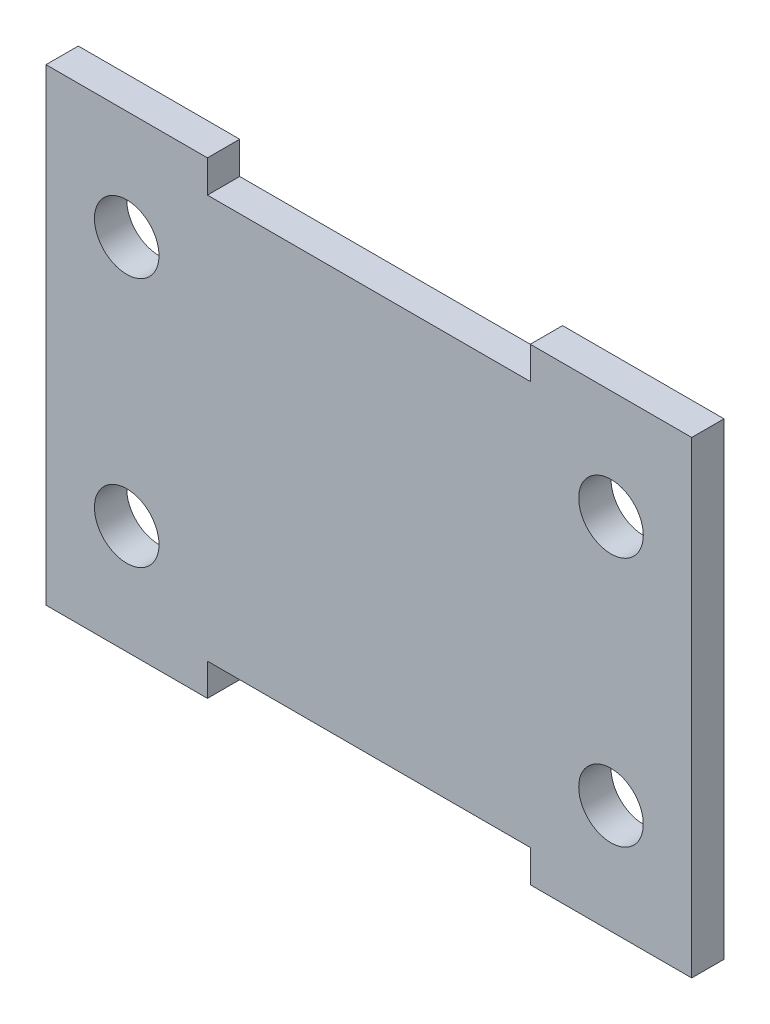
ISO-10303-21;
HEADER;
FILE_DESCRIPTION(('STEP AP214'),'2;1');
FILE_NAME('part.step','',(''),(''),'','','');
FILE_SCHEMA(('AUTOMOTIVE_DESIGN { 1 0 10303 214 1 1 1 1 }'));
ENDSEC;
DATA;
#1=APPLICATION_CONTEXT('core data for automotive mechanical design processes');
#2=APPLICATION_PROTOCOL_DEFINITION('international standard','automotive_design',2000,#1);
#3=PRODUCT_CONTEXT('',#1,'mechanical');
#4=PRODUCT('Part','Part','',(#3));
#5=PRODUCT_RELATED_PRODUCT_CATEGORY('part','',(#4));
#6=PRODUCT_DEFINITION_FORMATION('','',#4);
#7=PRODUCT_DEFINITION_CONTEXT('part definition',#1,'design');
#8=PRODUCT_DEFINITION('design','',#6,#7);
#9=PRODUCT_DEFINITION_SHAPE('','',#8);
#10=(LENGTH_UNIT() NAMED_UNIT(*) SI_UNIT(.MILLI.,.METRE.));
#11=(NAMED_UNIT(*) PLANE_ANGLE_UNIT() SI_UNIT($,.RADIAN.));
#12=(NAMED_UNIT(*) SI_UNIT($,.STERADIAN.) SOLID_ANGLE_UNIT());
#13=UNCERTAINTY_MEASURE_WITH_UNIT(LENGTH_MEASURE(1.E-05),#10,'distance_accuracy_value','');
#14=(GEOMETRIC_REPRESENTATION_CONTEXT(3) GLOBAL_UNCERTAINTY_ASSIGNED_CONTEXT((#13)) GLOBAL_UNIT_ASSIGNED_CONTEXT((#10,
#11,#12)) REPRESENTATION_CONTEXT('',''));
#15=CARTESIAN_POINT('',(0.,0.,0.));
#16=DIRECTION('',(0.,0.,1.));
#17=DIRECTION('',(1.,0.,0.));
#18=AXIS2_PLACEMENT_3D('',#15,#16,#17);
#19=CARTESIAN_POINT('',(0.,0.,4.));
#20=DIRECTION('',(0.,0.,-1.));
#21=DIRECTION('',(-1.,0.,0.));
#22=AXIS2_PLACEMENT_3D('',#19,#20,#21);
#23=PLANE('',#22);
#24=DIRECTION('',(0.,1.,0.));
#25=VECTOR('',#24,1.);
#26=CARTESIAN_POINT('',(40.,-25.,4.));
#27=LINE('',#26,#25);
#28=CARTESIAN_POINT('',(39.9999999999999,-29.0000000000001,4.));
#29=VERTEX_POINT('',#28);
#30=CARTESIAN_POINT('',(40.0000000000001,28.9999999999999,4.));
#31=VERTEX_POINT('',#30);
#32=EDGE_CURVE('E104',#29,#31,#27,.T.);
#33=ORIENTED_EDGE('',*,*,#32,.T.);
#34=DIRECTION('',(-1.,0.,0.));
#35=VECTOR('',#34,1.);
#36=CARTESIAN_POINT('',(40.0000000000001,28.9999999999999,4.));
#37=LINE('',#36,#35);
#38=CARTESIAN_POINT('',(20.0000000000001,28.9999999999999,4.));
#39=VERTEX_POINT('',#38);
#40=EDGE_CURVE('E246',#31,#39,#37,.T.);
#41=ORIENTED_EDGE('',*,*,#40,.T.);
#42=DIRECTION('',(0.,-1.,0.));
#43=VECTOR('',#42,1.);
#44=CARTESIAN_POINT('',(20.,25.,4.));
#45=LINE('',#44,#43);
#46=CARTESIAN_POINT('',(20.,25.,4.));
#47=VERTEX_POINT('',#46);
#48=EDGE_CURVE('E205',#39,#47,#45,.T.);
#49=ORIENTED_EDGE('',*,*,#48,.T.);
#50=DIRECTION('',(-1.,0.,0.));
#51=VECTOR('',#50,1.);
#52=CARTESIAN_POINT('',(-20.,25.,4.));
#53=LINE('',#52,#51);
#54=CARTESIAN_POINT('',(-20.,25.,4.));
#55=VERTEX_POINT('',#54);
#56=EDGE_CURVE('E224',#47,#55,#53,.T.);
#57=ORIENTED_EDGE('',*,*,#56,.T.);
#58=DIRECTION('',(0.,1.,0.));
#59=VECTOR('',#58,1.);
#60=CARTESIAN_POINT('',(-20.,25.,4.));
#61=LINE('',#60,#59);
#62=CARTESIAN_POINT('',(-20.,29.,4.));
#63=VERTEX_POINT('',#62);
#64=EDGE_CURVE('E221',#55,#63,#61,.T.);
#65=ORIENTED_EDGE('',*,*,#64,.T.);
#66=DIRECTION('',(-1.,0.,0.));
#67=VECTOR('',#66,1.);
#68=CARTESIAN_POINT('',(-40.,29.,4.));
#69=LINE('',#68,#67);
#70=CARTESIAN_POINT('',(-40.,29.,4.));
#71=VERTEX_POINT('',#70);
#72=EDGE_CURVE('E223',#63,#71,#69,.T.);
#73=ORIENTED_EDGE('',*,*,#72,.T.);
#74=DIRECTION('',(0.,-1.,0.));
#75=VECTOR('',#74,1.);
#76=CARTESIAN_POINT('',(-40.,25.,4.));
#77=LINE('',#76,#75);
#78=CARTESIAN_POINT('',(-40.,-29.,4.));
#79=VERTEX_POINT('',#78);
#80=EDGE_CURVE('E226',#71,#79,#77,.T.);
#81=ORIENTED_EDGE('',*,*,#80,.T.);
#82=DIRECTION('',(1.,0.,0.));
#83=VECTOR('',#82,1.);
#84=CARTESIAN_POINT('',(-40.,-29.,4.));
#85=LINE('',#84,#83);
#86=CARTESIAN_POINT('',(-20.,-29.,4.));
#87=VERTEX_POINT('',#86);
#88=EDGE_CURVE('E232',#79,#87,#85,.T.);
#89=ORIENTED_EDGE('',*,*,#88,.T.);
#90=DIRECTION('',(0.,1.,0.));
#91=VECTOR('',#90,1.);
#92=CARTESIAN_POINT('',(-20.,-25.,4.));
#93=LINE('',#92,#91);
#94=CARTESIAN_POINT('',(-20.,-25.,4.));
#95=VERTEX_POINT('',#94);
#96=EDGE_CURVE('E136',#87,#95,#93,.T.);
#97=ORIENTED_EDGE('',*,*,#96,.T.);
#98=DIRECTION('',(1.,0.,0.));
#99=VECTOR('',#98,1.);
#100=CARTESIAN_POINT('',(-20.,-25.,4.));
#101=LINE('',#100,#99);
#102=CARTESIAN_POINT('',(19.9999999999999,-25.0000000000001,4.));
#103=VERTEX_POINT('',#102);
#104=EDGE_CURVE('E130',#95,#103,#101,.T.);
#105=ORIENTED_EDGE('',*,*,#104,.T.);
#106=DIRECTION('',(0.,-1.,0.));
#107=VECTOR('',#106,1.);
#108=CARTESIAN_POINT('',(19.9999999999999,-25.0000000000001,4.));
#109=LINE('',#108,#107);
#110=CARTESIAN_POINT('',(19.9999999999999,-29.0000000000001,4.));
#111=VERTEX_POINT('',#110);
#112=EDGE_CURVE('E134',#103,#111,#109,.T.);
#113=ORIENTED_EDGE('',*,*,#112,.T.);
#114=DIRECTION('',(1.,0.,0.));
#115=VECTOR('',#114,1.);
#116=CARTESIAN_POINT('',(39.9999999999999,-29.0000000000001,4.));
#117=LINE('',#116,#115);
#118=EDGE_CURVE('E50',#111,#29,#117,.T.);
#119=ORIENTED_EDGE('',*,*,#118,.T.);
#120=EDGE_LOOP('',(#33,#41,#49,#57,#65,#73,#81,#89,#97,#105,#113,#119));
#121=FACE_BOUND('',#120,.T.);
#122=CARTESIAN_POINT('',(30.,15.5,4.));
#123=DIRECTION('',(0.,0.,1.));
#124=DIRECTION('',(1.,0.,0.));
#125=AXIS2_PLACEMENT_3D('',#122,#123,#124);
#126=CIRCLE('',#125,4.);
#127=CARTESIAN_POINT('',(34.,15.5,4.));
#128=VERTEX_POINT('',#127);
#129=EDGE_CURVE('E156',#128,#128,#126,.T.);
#130=ORIENTED_EDGE('',*,*,#129,.F.);
#131=EDGE_LOOP('',(#130));
#132=FACE_BOUND('',#131,.T.);
#133=CARTESIAN_POINT('',(-30.,15.5,4.));
#134=DIRECTION('',(0.,0.,1.));
#135=DIRECTION('',(-1.,0.,0.));
#136=AXIS2_PLACEMENT_3D('',#133,#134,#135);
#137=CIRCLE('',#136,4.);
#138=CARTESIAN_POINT('',(-34.,15.5,4.));
#139=VERTEX_POINT('',#138);
#140=EDGE_CURVE('E438',#139,#139,#137,.T.);
#141=ORIENTED_EDGE('',*,*,#140,.F.);
#142=EDGE_LOOP('',(#141));
#143=FACE_BOUND('',#142,.T.);
#144=CARTESIAN_POINT('',(-30.,-15.5,4.));
#145=DIRECTION('',(0.,0.,1.));
#146=DIRECTION('',(1.,0.,0.));
#147=AXIS2_PLACEMENT_3D('',#144,#145,#146);
#148=CIRCLE('',#147,3.99999999999999);
#149=CARTESIAN_POINT('',(-26.,-15.5,4.));
#150=VERTEX_POINT('',#149);
#151=EDGE_CURVE('E432',#150,#150,#148,.T.);
#152=ORIENTED_EDGE('',*,*,#151,.F.);
#153=EDGE_LOOP('',(#152));
#154=FACE_BOUND('',#153,.T.);
#155=CARTESIAN_POINT('',(30.,-15.5,4.));
#156=DIRECTION('',(0.,0.,1.));
#157=DIRECTION('',(-1.,0.,0.));
#158=AXIS2_PLACEMENT_3D('',#155,#156,#157);
#159=CIRCLE('',#158,4.);
#160=CARTESIAN_POINT('',(26.,-15.5,4.));
#161=VERTEX_POINT('',#160);
#162=EDGE_CURVE('E423',#161,#161,#159,.T.);
#163=ORIENTED_EDGE('',*,*,#162,.F.);
#164=EDGE_LOOP('',(#163));
#165=FACE_BOUND('',#164,.T.);
#166=ADVANCED_FACE('F33',(#121,#132,#143,#154,#165),#23,.F.);
#167=CARTESIAN_POINT('',(0.,0.,0.));
#168=DIRECTION('',(0.,0.,-1.));
#169=DIRECTION('',(-1.,0.,0.));
#170=AXIS2_PLACEMENT_3D('',#167,#168,#169);
#171=PLANE('',#170);
#172=CARTESIAN_POINT('',(-30.,-15.5,0.));
#173=DIRECTION('',(0.,0.,1.));
#174=DIRECTION('',(1.,0.,0.));
#175=AXIS2_PLACEMENT_3D('',#172,#173,#174);
#176=CIRCLE('',#175,3.99999999999999);
#177=CARTESIAN_POINT('',(-26.,-15.5,0.));
#178=VERTEX_POINT('',#177);
#179=EDGE_CURVE('E429',#178,#178,#176,.T.);
#180=ORIENTED_EDGE('',*,*,#179,.T.);
#181=EDGE_LOOP('',(#180));
#182=FACE_BOUND('',#181,.T.);
#183=CARTESIAN_POINT('',(30.,15.5,0.));
#184=DIRECTION('',(0.,0.,1.));
#185=DIRECTION('',(1.,0.,0.));
#186=AXIS2_PLACEMENT_3D('',#183,#184,#185);
#187=CIRCLE('',#186,4.);
#188=CARTESIAN_POINT('',(34.,15.5,0.));
#189=VERTEX_POINT('',#188);
#190=EDGE_CURVE('E250',#189,#189,#187,.T.);
#191=ORIENTED_EDGE('',*,*,#190,.T.);
#192=EDGE_LOOP('',(#191));
#193=FACE_BOUND('',#192,.T.);
#194=DIRECTION('',(0.,1.,0.));
#195=VECTOR('',#194,1.);
#196=CARTESIAN_POINT('',(40.,25.,0.));
#197=LINE('',#196,#195);
#198=CARTESIAN_POINT('',(39.9999999999999,-29.0000000000001,0.));
#199=VERTEX_POINT('',#198);
#200=CARTESIAN_POINT('',(40.0000000000001,28.9999999999999,0.));
#201=VERTEX_POINT('',#200);
#202=EDGE_CURVE('E98',#199,#201,#197,.T.);
#203=ORIENTED_EDGE('',*,*,#202,.F.);
#204=DIRECTION('',(1.,0.,0.));
#205=VECTOR('',#204,1.);
#206=CARTESIAN_POINT('',(39.9999999999999,-29.0000000000001,0.));
#207=LINE('',#206,#205);
#208=CARTESIAN_POINT('',(19.9999999999999,-29.0000000000001,0.));
#209=VERTEX_POINT('',#208);
#210=EDGE_CURVE('E175',#209,#199,#207,.T.);
#211=ORIENTED_EDGE('',*,*,#210,.F.);
#212=DIRECTION('',(0.,-1.,0.));
#213=VECTOR('',#212,1.);
#214=CARTESIAN_POINT('',(19.9999999999999,-25.0000000000001,0.));
#215=LINE('',#214,#213);
#216=CARTESIAN_POINT('',(19.9999999999999,-25.0000000000001,0.));
#217=VERTEX_POINT('',#216);
#218=EDGE_CURVE('E91',#217,#209,#215,.T.);
#219=ORIENTED_EDGE('',*,*,#218,.F.);
#220=DIRECTION('',(1.,0.,0.));
#221=VECTOR('',#220,1.);
#222=CARTESIAN_POINT('',(-20.,-25.,0.));
#223=LINE('',#222,#221);
#224=CARTESIAN_POINT('',(-20.,-25.,0.));
#225=VERTEX_POINT('',#224);
#226=EDGE_CURVE('E144',#225,#217,#223,.T.);
#227=ORIENTED_EDGE('',*,*,#226,.F.);
#228=DIRECTION('',(0.,1.,0.));
#229=VECTOR('',#228,1.);
#230=CARTESIAN_POINT('',(-20.,-25.,0.));
#231=LINE('',#230,#229);
#232=CARTESIAN_POINT('',(-20.,-29.,0.));
#233=VERTEX_POINT('',#232);
#234=EDGE_CURVE('E171',#233,#225,#231,.T.);
#235=ORIENTED_EDGE('',*,*,#234,.F.);
#236=DIRECTION('',(1.,0.,0.));
#237=VECTOR('',#236,1.);
#238=CARTESIAN_POINT('',(-40.,-29.,0.));
#239=LINE('',#238,#237);
#240=CARTESIAN_POINT('',(-40.,-29.,0.));
#241=VERTEX_POINT('',#240);
#242=EDGE_CURVE('E169',#241,#233,#239,.T.);
#243=ORIENTED_EDGE('',*,*,#242,.F.);
#244=DIRECTION('',(0.,-1.,0.));
#245=VECTOR('',#244,1.);
#246=CARTESIAN_POINT('',(-40.,-25.,0.));
#247=LINE('',#246,#245);
#248=CARTESIAN_POINT('',(-40.,29.,0.));
#249=VERTEX_POINT('',#248);
#250=EDGE_CURVE('E167',#249,#241,#247,.T.);
#251=ORIENTED_EDGE('',*,*,#250,.F.);
#252=DIRECTION('',(-1.,0.,0.));
#253=VECTOR('',#252,1.);
#254=CARTESIAN_POINT('',(-40.,29.,0.));
#255=LINE('',#254,#253);
#256=CARTESIAN_POINT('',(-20.,29.,0.));
#257=VERTEX_POINT('',#256);
#258=EDGE_CURVE('E164',#257,#249,#255,.T.);
#259=ORIENTED_EDGE('',*,*,#258,.F.);
#260=DIRECTION('',(0.,1.,0.));
#261=VECTOR('',#260,1.);
#262=CARTESIAN_POINT('',(-20.,25.,0.));
#263=LINE('',#262,#261);
#264=CARTESIAN_POINT('',(-20.,25.,0.));
#265=VERTEX_POINT('',#264);
#266=EDGE_CURVE('E162',#265,#257,#263,.T.);
#267=ORIENTED_EDGE('',*,*,#266,.F.);
#268=DIRECTION('',(-1.,0.,0.));
#269=VECTOR('',#268,1.);
#270=CARTESIAN_POINT('',(-20.,25.,0.));
#271=LINE('',#270,#269);
#272=CARTESIAN_POINT('',(20.,25.,0.));
#273=VERTEX_POINT('',#272);
#274=EDGE_CURVE('E160',#273,#265,#271,.T.);
#275=ORIENTED_EDGE('',*,*,#274,.F.);
#276=DIRECTION('',(0.,-1.,0.));
#277=VECTOR('',#276,1.);
#278=CARTESIAN_POINT('',(20.,25.,0.));
#279=LINE('',#278,#277);
#280=CARTESIAN_POINT('',(20.0000000000001,28.9999999999999,0.));
#281=VERTEX_POINT('',#280);
#282=EDGE_CURVE('E158',#281,#273,#279,.T.);
#283=ORIENTED_EDGE('',*,*,#282,.F.);
#284=DIRECTION('',(-1.,0.,0.));
#285=VECTOR('',#284,1.);
#286=CARTESIAN_POINT('',(40.0000000000001,28.9999999999999,0.));
#287=LINE('',#286,#285);
#288=EDGE_CURVE('E155',#201,#281,#287,.T.);
#289=ORIENTED_EDGE('',*,*,#288,.F.);
#290=EDGE_LOOP('',(#203,#211,#219,#227,#235,#243,#251,#259,#267,#275,#283,#289));
#291=FACE_BOUND('',#290,.T.);
#292=CARTESIAN_POINT('',(-30.,15.5,0.));
#293=DIRECTION('',(0.,0.,1.));
#294=DIRECTION('',(-1.,0.,0.));
#295=AXIS2_PLACEMENT_3D('',#292,#293,#294);
#296=CIRCLE('',#295,4.);
#297=CARTESIAN_POINT('',(-34.,15.5,0.));
#298=VERTEX_POINT('',#297);
#299=EDGE_CURVE('E435',#298,#298,#296,.T.);
#300=ORIENTED_EDGE('',*,*,#299,.T.);
#301=EDGE_LOOP('',(#300));
#302=FACE_BOUND('',#301,.T.);
#303=CARTESIAN_POINT('',(30.,-15.5,0.));
#304=DIRECTION('',(0.,0.,1.));
#305=DIRECTION('',(-1.,0.,0.));
#306=AXIS2_PLACEMENT_3D('',#303,#304,#305);
#307=CIRCLE('',#306,4.);
#308=CARTESIAN_POINT('',(26.,-15.5,0.));
#309=VERTEX_POINT('',#308);
#310=EDGE_CURVE('E426',#309,#309,#307,.T.);
#311=ORIENTED_EDGE('',*,*,#310,.T.);
#312=EDGE_LOOP('',(#311));
#313=FACE_BOUND('',#312,.T.);
#314=ADVANCED_FACE('F209',(#182,#193,#291,#302,#313),#171,.T.);
#315=CARTESIAN_POINT('',(40.,25.,4.));
#316=DIRECTION('',(-1.,0.,0.));
#317=DIRECTION('',(0.,-1.,0.));
#318=AXIS2_PLACEMENT_3D('',#315,#316,#317);
#319=PLANE('',#318);
#320=ORIENTED_EDGE('',*,*,#202,.T.);
#321=DIRECTION('',(0.,0.,-1.));
#322=VECTOR('',#321,1.);
#323=CARTESIAN_POINT('',(40.0000000000001,28.9999999999999,4.));
#324=LINE('',#323,#322);
#325=EDGE_CURVE('E11',#31,#201,#324,.T.);
#326=ORIENTED_EDGE('',*,*,#325,.F.);
#327=ORIENTED_EDGE('',*,*,#32,.F.);
#328=DIRECTION('',(0.,0.,-1.));
#329=VECTOR('',#328,1.);
#330=CARTESIAN_POINT('',(39.9999999999999,-29.0000000000001,4.));
#331=LINE('',#330,#329);
#332=EDGE_CURVE('E150',#29,#199,#331,.T.);
#333=ORIENTED_EDGE('',*,*,#332,.T.);
#334=EDGE_LOOP('',(#320,#326,#327,#333));
#335=FACE_BOUND('',#334,.T.);
#336=ADVANCED_FACE('F35',(#335),#319,.F.);
#337=CARTESIAN_POINT('',(40.0000000000001,28.9999999999999,4.));
#338=DIRECTION('',(0.,-1.,0.));
#339=DIRECTION('',(1.,0.,0.));
#340=AXIS2_PLACEMENT_3D('',#337,#338,#339);
#341=PLANE('',#340);
#342=ORIENTED_EDGE('',*,*,#288,.T.);
#343=DIRECTION('',(0.,0.,-1.));
#344=VECTOR('',#343,1.);
#345=CARTESIAN_POINT('',(20.0000000000001,28.9999999999999,4.));
#346=LINE('',#345,#344);
#347=EDGE_CURVE('E42',#39,#281,#346,.T.);
#348=ORIENTED_EDGE('',*,*,#347,.F.);
#349=ORIENTED_EDGE('',*,*,#40,.F.);
#350=ORIENTED_EDGE('',*,*,#325,.T.);
#351=EDGE_LOOP('',(#342,#348,#349,#350));
#352=FACE_BOUND('',#351,.T.);
#353=ADVANCED_FACE('F252',(#352),#341,.F.);
#354=CARTESIAN_POINT('',(20.,25.,4.));
#355=DIRECTION('',(1.,0.,0.));
#356=DIRECTION('',(0.,1.,0.));
#357=AXIS2_PLACEMENT_3D('',#354,#355,#356);
#358=PLANE('',#357);
#359=ORIENTED_EDGE('',*,*,#282,.T.);
#360=DIRECTION('',(0.,0.,-1.));
#361=VECTOR('',#360,1.);
#362=CARTESIAN_POINT('',(20.,25.,4.));
#363=LINE('',#362,#361);
#364=EDGE_CURVE('E196',#47,#273,#363,.T.);
#365=ORIENTED_EDGE('',*,*,#364,.F.);
#366=ORIENTED_EDGE('',*,*,#48,.F.);
#367=ORIENTED_EDGE('',*,*,#347,.T.);
#368=EDGE_LOOP('',(#359,#365,#366,#367));
#369=FACE_BOUND('',#368,.T.);
#370=ADVANCED_FACE('F203',(#369),#358,.F.);
#371=CARTESIAN_POINT('',(-20.,25.,4.));
#372=DIRECTION('',(0.,-1.,0.));
#373=DIRECTION('',(1.,0.,0.));
#374=AXIS2_PLACEMENT_3D('',#371,#372,#373);
#375=PLANE('',#374);
#376=ORIENTED_EDGE('',*,*,#274,.T.);
#377=DIRECTION('',(0.,0.,-1.));
#378=VECTOR('',#377,1.);
#379=CARTESIAN_POINT('',(-20.,25.,4.));
#380=LINE('',#379,#378);
#381=EDGE_CURVE('E193',#55,#265,#380,.T.);
#382=ORIENTED_EDGE('',*,*,#381,.F.);
#383=ORIENTED_EDGE('',*,*,#56,.F.);
#384=ORIENTED_EDGE('',*,*,#364,.T.);
#385=EDGE_LOOP('',(#376,#382,#383,#384));
#386=FACE_BOUND('',#385,.T.);
#387=ADVANCED_FACE('F215',(#386),#375,.F.);
#388=CARTESIAN_POINT('',(-20.,25.,4.));
#389=DIRECTION('',(-1.,0.,0.));
#390=DIRECTION('',(0.,0.,1.));
#391=AXIS2_PLACEMENT_3D('',#388,#389,#390);
#392=PLANE('',#391);
#393=ORIENTED_EDGE('',*,*,#266,.T.);
#394=DIRECTION('',(0.,0.,-1.));
#395=VECTOR('',#394,1.);
#396=CARTESIAN_POINT('',(-20.,29.,4.));
#397=LINE('',#396,#395);
#398=EDGE_CURVE('E190',#63,#257,#397,.T.);
#399=ORIENTED_EDGE('',*,*,#398,.F.);
#400=ORIENTED_EDGE('',*,*,#64,.F.);
#401=ORIENTED_EDGE('',*,*,#381,.T.);
#402=EDGE_LOOP('',(#393,#399,#400,#401));
#403=FACE_BOUND('',#402,.T.);
#404=ADVANCED_FACE('F219',(#403),#392,.F.);
#405=CARTESIAN_POINT('',(-40.,29.,4.));
#406=DIRECTION('',(0.,-1.,0.));
#407=DIRECTION('',(0.,0.,-1.));
#408=AXIS2_PLACEMENT_3D('',#405,#406,#407);
#409=PLANE('',#408);
#410=ORIENTED_EDGE('',*,*,#258,.T.);
#411=DIRECTION('',(0.,0.,-1.));
#412=VECTOR('',#411,1.);
#413=CARTESIAN_POINT('',(-40.,29.,4.));
#414=LINE('',#413,#412);
#415=EDGE_CURVE('E187',#71,#249,#414,.T.);
#416=ORIENTED_EDGE('',*,*,#415,.F.);
#417=ORIENTED_EDGE('',*,*,#72,.F.);
#418=ORIENTED_EDGE('',*,*,#398,.T.);
#419=EDGE_LOOP('',(#410,#416,#417,#418));
#420=FACE_BOUND('',#419,.T.);
#421=ADVANCED_FACE('F283',(#420),#409,.F.);
#422=CARTESIAN_POINT('',(-40.,-25.,4.));
#423=DIRECTION('',(1.,0.,0.));
#424=DIRECTION('',(0.,0.,-1.));
#425=AXIS2_PLACEMENT_3D('',#422,#423,#424);
#426=PLANE('',#425);
#427=ORIENTED_EDGE('',*,*,#250,.T.);
#428=DIRECTION('',(0.,0.,-1.));
#429=VECTOR('',#428,1.);
#430=CARTESIAN_POINT('',(-40.,-29.,4.));
#431=LINE('',#430,#429);
#432=EDGE_CURVE('E184',#79,#241,#431,.T.);
#433=ORIENTED_EDGE('',*,*,#432,.F.);
#434=ORIENTED_EDGE('',*,*,#80,.F.);
#435=ORIENTED_EDGE('',*,*,#415,.T.);
#436=EDGE_LOOP('',(#427,#433,#434,#435));
#437=FACE_BOUND('',#436,.T.);
#438=ADVANCED_FACE('F280',(#437),#426,.F.);
#439=CARTESIAN_POINT('',(-40.,-29.,4.));
#440=DIRECTION('',(0.,1.,0.));
#441=DIRECTION('',(0.,0.,1.));
#442=AXIS2_PLACEMENT_3D('',#439,#440,#441);
#443=PLANE('',#442);
#444=ORIENTED_EDGE('',*,*,#242,.T.);
#445=DIRECTION('',(0.,0.,-1.));
#446=VECTOR('',#445,1.);
#447=CARTESIAN_POINT('',(-20.,-29.,4.));
#448=LINE('',#447,#446);
#449=EDGE_CURVE('E181',#87,#233,#448,.T.);
#450=ORIENTED_EDGE('',*,*,#449,.F.);
#451=ORIENTED_EDGE('',*,*,#88,.F.);
#452=ORIENTED_EDGE('',*,*,#432,.T.);
#453=EDGE_LOOP('',(#444,#450,#451,#452));
#454=FACE_BOUND('',#453,.T.);
#455=ADVANCED_FACE('F238',(#454),#443,.F.);
#456=CARTESIAN_POINT('',(-20.,-25.,4.));
#457=DIRECTION('',(-1.,0.,0.));
#458=DIRECTION('',(0.,0.,1.));
#459=AXIS2_PLACEMENT_3D('',#456,#457,#458);
#460=PLANE('',#459);
#461=ORIENTED_EDGE('',*,*,#234,.T.);
#462=DIRECTION('',(0.,0.,-1.));
#463=VECTOR('',#462,1.);
#464=CARTESIAN_POINT('',(-20.,-25.,4.));
#465=LINE('',#464,#463);
#466=EDGE_CURVE('E145',#95,#225,#465,.T.);
#467=ORIENTED_EDGE('',*,*,#466,.F.);
#468=ORIENTED_EDGE('',*,*,#96,.F.);
#469=ORIENTED_EDGE('',*,*,#449,.T.);
#470=EDGE_LOOP('',(#461,#467,#468,#469));
#471=FACE_BOUND('',#470,.T.);
#472=ADVANCED_FACE('F242',(#471),#460,.F.);
#473=CARTESIAN_POINT('',(-20.,-25.,4.));
#474=DIRECTION('',(0.,1.,0.));
#475=DIRECTION('',(-1.,0.,0.));
#476=AXIS2_PLACEMENT_3D('',#473,#474,#475);
#477=PLANE('',#476);
#478=ORIENTED_EDGE('',*,*,#226,.T.);
#479=DIRECTION('',(0.,0.,-1.));
#480=VECTOR('',#479,1.);
#481=CARTESIAN_POINT('',(19.9999999999999,-25.0000000000001,4.));
#482=LINE('',#481,#480);
#483=EDGE_CURVE('E141',#103,#217,#482,.T.);
#484=ORIENTED_EDGE('',*,*,#483,.F.);
#485=ORIENTED_EDGE('',*,*,#104,.F.);
#486=ORIENTED_EDGE('',*,*,#466,.T.);
#487=EDGE_LOOP('',(#478,#484,#485,#486));
#488=FACE_BOUND('',#487,.T.);
#489=ADVANCED_FACE('F142',(#488),#477,.F.);
#490=CARTESIAN_POINT('',(19.9999999999999,-25.0000000000001,4.));
#491=DIRECTION('',(1.,0.,0.));
#492=DIRECTION('',(0.,1.,0.));
#493=AXIS2_PLACEMENT_3D('',#490,#491,#492);
#494=PLANE('',#493);
#495=ORIENTED_EDGE('',*,*,#218,.T.);
#496=DIRECTION('',(0.,0.,-1.));
#497=VECTOR('',#496,1.);
#498=CARTESIAN_POINT('',(19.9999999999999,-29.0000000000001,4.));
#499=LINE('',#498,#497);
#500=EDGE_CURVE('E146',#111,#209,#499,.T.);
#501=ORIENTED_EDGE('',*,*,#500,.F.);
#502=ORIENTED_EDGE('',*,*,#112,.F.);
#503=ORIENTED_EDGE('',*,*,#483,.T.);
#504=EDGE_LOOP('',(#495,#501,#502,#503));
#505=FACE_BOUND('',#504,.T.);
#506=ADVANCED_FACE('F148',(#505),#494,.F.);
#507=CARTESIAN_POINT('',(39.9999999999999,-29.0000000000001,4.));
#508=DIRECTION('',(0.,1.,0.));
#509=DIRECTION('',(-1.,0.,0.));
#510=AXIS2_PLACEMENT_3D('',#507,#508,#509);
#511=PLANE('',#510);
#512=ORIENTED_EDGE('',*,*,#210,.T.);
#513=ORIENTED_EDGE('',*,*,#332,.F.);
#514=ORIENTED_EDGE('',*,*,#118,.F.);
#515=ORIENTED_EDGE('',*,*,#500,.T.);
#516=EDGE_LOOP('',(#512,#513,#514,#515));
#517=FACE_BOUND('',#516,.T.);
#518=ADVANCED_FACE('F244',(#517),#511,.F.);
#519=CARTESIAN_POINT('',(30.,15.5,4.));
#520=DIRECTION('',(0.,0.,-1.));
#521=DIRECTION('',(-1.,0.,0.));
#522=AXIS2_PLACEMENT_3D('',#519,#520,#521);
#523=CYLINDRICAL_SURFACE('',#522,4.);
#524=ORIENTED_EDGE('',*,*,#129,.T.);
#525=EDGE_LOOP('',(#524));
#526=FACE_BOUND('',#525,.T.);
#527=ORIENTED_EDGE('',*,*,#190,.F.);
#528=EDGE_LOOP('',(#527));
#529=FACE_BOUND('',#528,.T.);
#530=ADVANCED_FACE('F267',(#526,#529),#523,.F.);
#531=CARTESIAN_POINT('',(-30.,15.5,4.));
#532=DIRECTION('',(0.,0.,-1.));
#533=DIRECTION('',(-1.,0.,0.));
#534=AXIS2_PLACEMENT_3D('',#531,#532,#533);
#535=CYLINDRICAL_SURFACE('',#534,4.);
#536=ORIENTED_EDGE('',*,*,#140,.T.);
#537=EDGE_LOOP('',(#536));
#538=FACE_BOUND('',#537,.T.);
#539=ORIENTED_EDGE('',*,*,#299,.F.);
#540=EDGE_LOOP('',(#539));
#541=FACE_BOUND('',#540,.T.);
#542=ADVANCED_FACE('F333',(#538,#541),#535,.F.);
#543=CARTESIAN_POINT('',(-30.,-15.5,4.));
#544=DIRECTION('',(0.,0.,-1.));
#545=DIRECTION('',(-1.,0.,0.));
#546=AXIS2_PLACEMENT_3D('',#543,#544,#545);
#547=CYLINDRICAL_SURFACE('',#546,3.99999999999999);
#548=ORIENTED_EDGE('',*,*,#151,.T.);
#549=EDGE_LOOP('',(#548));
#550=FACE_BOUND('',#549,.T.);
#551=ORIENTED_EDGE('',*,*,#179,.F.);
#552=EDGE_LOOP('',(#551));
#553=FACE_BOUND('',#552,.T.);
#554=ADVANCED_FACE('F340',(#550,#553),#547,.F.);
#555=CARTESIAN_POINT('',(30.,-15.5,4.));
#556=DIRECTION('',(0.,0.,-1.));
#557=DIRECTION('',(-1.,0.,0.));
#558=AXIS2_PLACEMENT_3D('',#555,#556,#557);
#559=CYLINDRICAL_SURFACE('',#558,4.);
#560=ORIENTED_EDGE('',*,*,#162,.T.);
#561=EDGE_LOOP('',(#560));
#562=FACE_BOUND('',#561,.T.);
#563=ORIENTED_EDGE('',*,*,#310,.F.);
#564=EDGE_LOOP('',(#563));
#565=FACE_BOUND('',#564,.T.);
#566=ADVANCED_FACE('F347',(#562,#565),#559,.F.);
#567=CLOSED_SHELL('',(#166,#314,#336,#353,#370,#387,#404,#421,#438,#455,#472,#489,#506,#518,
#530,#542,#554,#566));
#568=MANIFOLD_SOLID_BREP('B2',#567);
#569=ADVANCED_BREP_SHAPE_REPRESENTATION('',(#18,#568),#14);
#570=SHAPE_DEFINITION_REPRESENTATION(#9,#569);
ENDSEC;
END-ISO-10303-21;
